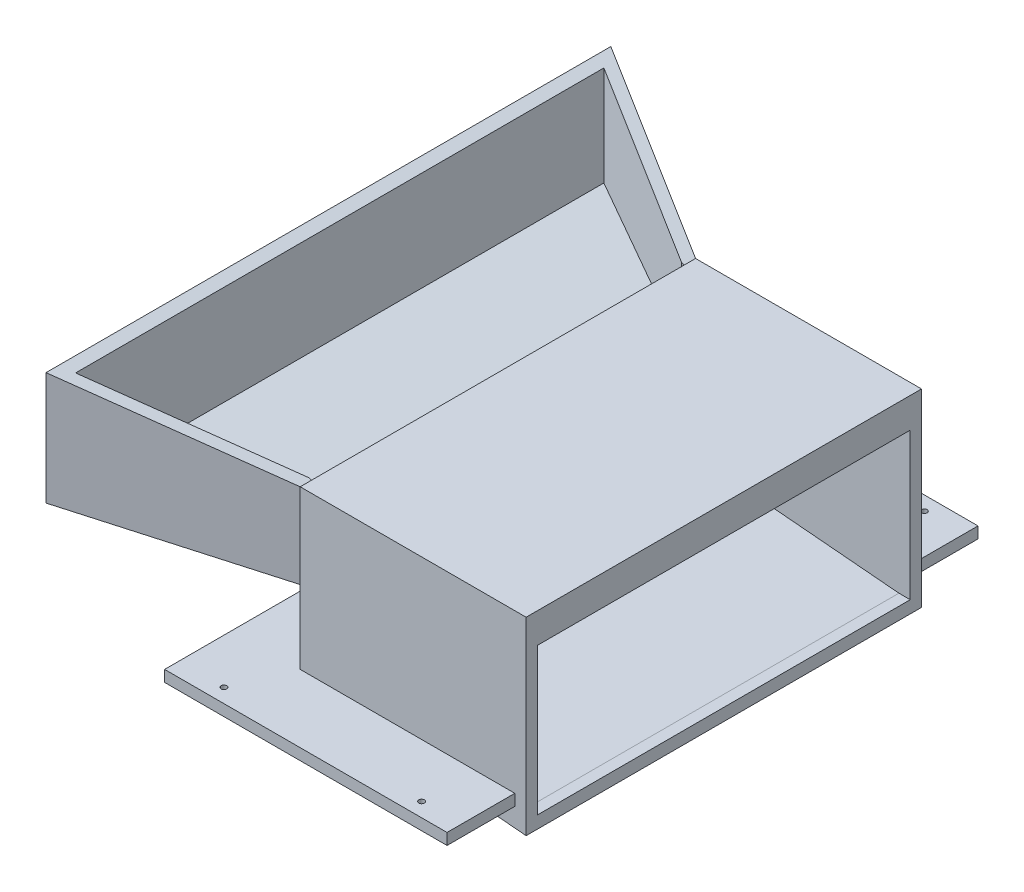
ISO-10303-21;
HEADER;
FILE_DESCRIPTION(('STEP AP214'),'2;1');
FILE_NAME('part.step','',(''),(''),'','','');
FILE_SCHEMA(('AUTOMOTIVE_DESIGN { 1 0 10303 214 1 1 1 1 }'));
ENDSEC;
DATA;
#1=APPLICATION_CONTEXT('core data for automotive mechanical design processes');
#2=APPLICATION_PROTOCOL_DEFINITION('international standard','automotive_design',2000,#1);
#3=PRODUCT_CONTEXT('',#1,'mechanical');
#4=PRODUCT('Part','Part','',(#3));
#5=PRODUCT_RELATED_PRODUCT_CATEGORY('part','',(#4));
#6=PRODUCT_DEFINITION_FORMATION('','',#4);
#7=PRODUCT_DEFINITION_CONTEXT('part definition',#1,'design');
#8=PRODUCT_DEFINITION('design','',#6,#7);
#9=PRODUCT_DEFINITION_SHAPE('','',#8);
#10=(LENGTH_UNIT() NAMED_UNIT(*) SI_UNIT(.MILLI.,.METRE.));
#11=(NAMED_UNIT(*) PLANE_ANGLE_UNIT() SI_UNIT($,.RADIAN.));
#12=(NAMED_UNIT(*) SI_UNIT($,.STERADIAN.) SOLID_ANGLE_UNIT());
#13=UNCERTAINTY_MEASURE_WITH_UNIT(LENGTH_MEASURE(1.E-05),#10,'distance_accuracy_value','');
#14=(GEOMETRIC_REPRESENTATION_CONTEXT(3) GLOBAL_UNCERTAINTY_ASSIGNED_CONTEXT((#13)) GLOBAL_UNIT_ASSIGNED_CONTEXT((#10,
#11,#12)) REPRESENTATION_CONTEXT('',''));
#15=CARTESIAN_POINT('',(0.,0.,0.));
#16=DIRECTION('',(0.,0.,1.));
#17=DIRECTION('',(1.,0.,0.));
#18=AXIS2_PLACEMENT_3D('',#15,#16,#17);
#19=CARTESIAN_POINT('',(90.,200.,-175.));
#20=DIRECTION('',(-1.,0.,0.));
#21=DIRECTION('',(0.,0.,1.));
#22=AXIS2_PLACEMENT_3D('',#19,#20,#21);
#23=PLANE('',#22);
#24=DIRECTION('',(0.,-1.,0.));
#25=VECTOR('',#24,1.);
#26=CARTESIAN_POINT('',(90.,200.,-165.));
#27=LINE('',#26,#25);
#28=CARTESIAN_POINT('',(90.,340.,-165.));
#29=VERTEX_POINT('',#28);
#30=CARTESIAN_POINT('',(90.,323.415352305509,-165.));
#31=VERTEX_POINT('',#30);
#32=EDGE_CURVE('E327',#29,#31,#27,.T.);
#33=ORIENTED_EDGE('',*,*,#32,.T.);
#34=DIRECTION('',(0.,0.,1.));
#35=VECTOR('',#34,1.);
#36=CARTESIAN_POINT('',(90.,323.415352305509,-165.));
#37=LINE('',#36,#35);
#38=CARTESIAN_POINT('',(90.0000000000001,323.415352305508,165.));
#39=VERTEX_POINT('',#38);
#40=EDGE_CURVE('E320',#31,#39,#37,.T.);
#41=ORIENTED_EDGE('',*,*,#40,.T.);
#42=DIRECTION('',(0.,-1.,0.));
#43=VECTOR('',#42,1.);
#44=CARTESIAN_POINT('',(90.0000000000001,200.,165.));
#45=LINE('',#44,#43);
#46=CARTESIAN_POINT('',(90.0000000000001,340.,165.));
#47=VERTEX_POINT('',#46);
#48=EDGE_CURVE('E359',#47,#39,#45,.T.);
#49=ORIENTED_EDGE('',*,*,#48,.F.);
#50=DIRECTION('',(0.,0.,-1.));
#51=VECTOR('',#50,1.);
#52=CARTESIAN_POINT('',(90.,340.,-175.));
#53=LINE('',#52,#51);
#54=EDGE_CURVE('E617',#47,#29,#53,.T.);
#55=ORIENTED_EDGE('',*,*,#54,.T.);
#56=EDGE_LOOP('',(#33,#41,#49,#55));
#57=FACE_BOUND('',#56,.T.);
#58=ADVANCED_FACE('F55',(#57),#23,.T.);
#59=CARTESIAN_POINT('',(95.0000000000002,285.,0.));
#60=DIRECTION('',(0.316227766016839,0.948683298050514,0.));
#61=DIRECTION('',(-0.948683298050514,0.316227766016839,0.));
#62=AXIS2_PLACEMENT_3D('',#59,#60,#61);
#63=PLANE('',#62);
#64=DIRECTION('',(0.,0.,1.));
#65=VECTOR('',#64,1.);
#66=CARTESIAN_POINT('',(-100.,350.,0.));
#67=LINE('',#66,#65);
#68=CARTESIAN_POINT('',(-100.,350.,165.));
#69=VERTEX_POINT('',#68);
#70=CARTESIAN_POINT('',(-100.,350.,175.));
#71=VERTEX_POINT('',#70);
#72=EDGE_CURVE('E377',#69,#71,#67,.T.);
#73=ORIENTED_EDGE('',*,*,#72,.F.);
#74=DIRECTION('',(-0.948683298050514,0.316227766016839,0.));
#75=VECTOR('',#74,1.);
#76=CARTESIAN_POINT('',(95.0000000000002,285.,165.));
#77=LINE('',#76,#75);
#78=CARTESIAN_POINT('',(-102.360679774998,350.786893258333,165.));
#79=VERTEX_POINT('',#78);
#80=EDGE_CURVE('E12',#69,#79,#77,.T.);
#81=ORIENTED_EDGE('',*,*,#80,.T.);
#82=DIRECTION('',(0.857142857142857,-0.285714285714286,-0.428571428571429));
#83=VECTOR('',#82,1.);
#84=CARTESIAN_POINT('',(119.36232412296,276.879225292347,54.1384980510211));
#85=LINE('',#84,#83);
#86=CARTESIAN_POINT('',(-240.,396.666666666667,233.819660112501));
#87=VERTEX_POINT('',#86);
#88=EDGE_CURVE('E569',#87,#79,#85,.T.);
#89=ORIENTED_EDGE('',*,*,#88,.F.);
#90=DIRECTION('',(0.,0.,-1.));
#91=VECTOR('',#90,1.);
#92=CARTESIAN_POINT('',(-240.,396.666666666667,0.));
#93=LINE('',#92,#91);
#94=CARTESIAN_POINT('',(-240.,396.666666666667,-233.819660112501));
#95=VERTEX_POINT('',#94);
#96=EDGE_CURVE('E579',#87,#95,#93,.T.);
#97=ORIENTED_EDGE('',*,*,#96,.T.);
#98=DIRECTION('',(0.857142857142857,-0.285714285714286,0.428571428571429));
#99=VECTOR('',#98,1.);
#100=CARTESIAN_POINT('',(119.36232412296,276.879225292347,-54.1384980510211));
#101=LINE('',#100,#99);
#102=CARTESIAN_POINT('',(-102.360679774998,350.786893258333,-165.));
#103=VERTEX_POINT('',#102);
#104=EDGE_CURVE('E565',#95,#103,#101,.T.);
#105=ORIENTED_EDGE('',*,*,#104,.T.);
#106=DIRECTION('',(0.948683298050514,-0.316227766016839,0.));
#107=VECTOR('',#106,1.);
#108=CARTESIAN_POINT('',(95.0000000000002,285.,-165.));
#109=LINE('',#108,#107);
#110=CARTESIAN_POINT('',(-100.,350.,-165.));
#111=VERTEX_POINT('',#110);
#112=EDGE_CURVE('E501',#103,#111,#109,.T.);
#113=ORIENTED_EDGE('',*,*,#112,.T.);
#114=CARTESIAN_POINT('',(-100.,350.,-175.));
#115=VERTEX_POINT('',#114);
#116=EDGE_CURVE('E371',#115,#111,#67,.T.);
#117=ORIENTED_EDGE('',*,*,#116,.F.);
#118=DIRECTION('',(0.857142857142857,-0.285714285714286,0.428571428571429));
#119=VECTOR('',#118,1.);
#120=CARTESIAN_POINT('',(-250.,400.,-250.));
#121=LINE('',#120,#119);
#122=CARTESIAN_POINT('',(-250.,400.,-250.));
#123=VERTEX_POINT('',#122);
#124=EDGE_CURVE('E498',#123,#115,#121,.T.);
#125=ORIENTED_EDGE('',*,*,#124,.F.);
#126=DIRECTION('',(0.,0.,-1.));
#127=VECTOR('',#126,1.);
#128=CARTESIAN_POINT('',(-250.,400.,-250.));
#129=LINE('',#128,#127);
#130=CARTESIAN_POINT('',(-250.,400.,250.));
#131=VERTEX_POINT('',#130);
#132=EDGE_CURVE('E480',#131,#123,#129,.T.);
#133=ORIENTED_EDGE('',*,*,#132,.F.);
#134=DIRECTION('',(0.857142857142857,-0.285714285714286,-0.428571428571429));
#135=VECTOR('',#134,1.);
#136=CARTESIAN_POINT('',(-250.,400.,250.));
#137=LINE('',#136,#135);
#138=EDGE_CURVE('E386',#131,#71,#137,.T.);
#139=ORIENTED_EDGE('',*,*,#138,.T.);
#140=EDGE_LOOP('',(#73,#81,#89,#97,#105,#113,#117,#125,#133,#139));
#141=FACE_BOUND('',#140,.T.);
#142=ADVANCED_FACE('F504',(#141),#63,.T.);
#143=CARTESIAN_POINT('',(100.,200.,-175.));
#144=DIRECTION('',(-1.,0.,0.));
#145=DIRECTION('',(0.,0.,1.));
#146=AXIS2_PLACEMENT_3D('',#143,#144,#145);
#147=PLANE('',#146);
#148=DIRECTION('',(0.,-1.,0.));
#149=VECTOR('',#148,1.);
#150=CARTESIAN_POINT('',(100.,323.415352305508,165.));
#151=LINE('',#150,#149);
#152=CARTESIAN_POINT('',(100.,323.415352305508,165.));
#153=VERTEX_POINT('',#152);
#154=CARTESIAN_POINT('',(100.,193.415352305508,165.));
#155=VERTEX_POINT('',#154);
#156=EDGE_CURVE('E673',#153,#155,#151,.T.);
#157=ORIENTED_EDGE('',*,*,#156,.F.);
#158=DIRECTION('',(0.,0.,1.));
#159=VECTOR('',#158,1.);
#160=CARTESIAN_POINT('',(100.,323.415352305509,-165.));
#161=LINE('',#160,#159);
#162=CARTESIAN_POINT('',(100.,323.415352305509,-165.));
#163=VERTEX_POINT('',#162);
#164=EDGE_CURVE('E315',#163,#153,#161,.T.);
#165=ORIENTED_EDGE('',*,*,#164,.F.);
#166=DIRECTION('',(0.,1.,0.));
#167=VECTOR('',#166,1.);
#168=CARTESIAN_POINT('',(100.,193.415352305508,-165.));
#169=LINE('',#168,#167);
#170=CARTESIAN_POINT('',(100.,193.415352305508,-165.));
#171=VERTEX_POINT('',#170);
#172=EDGE_CURVE('E326',#171,#163,#169,.T.);
#173=ORIENTED_EDGE('',*,*,#172,.F.);
#174=DIRECTION('',(0.,0.,-1.));
#175=VECTOR('',#174,1.);
#176=CARTESIAN_POINT('',(100.,193.415352305508,165.));
#177=LINE('',#176,#175);
#178=EDGE_CURVE('E676',#155,#171,#177,.T.);
#179=ORIENTED_EDGE('',*,*,#178,.F.);
#180=EDGE_LOOP('',(#157,#165,#173,#179));
#181=FACE_BOUND('',#180,.T.);
#182=DIRECTION('',(0.,-1.,0.));
#183=VECTOR('',#182,1.);
#184=CARTESIAN_POINT('',(100.,200.,175.));
#185=LINE('',#184,#183);
#186=CARTESIAN_POINT('',(100.,350.,175.));
#187=VERTEX_POINT('',#186);
#188=CARTESIAN_POINT('',(100.,182.502267294816,175.));
#189=VERTEX_POINT('',#188);
#190=EDGE_CURVE('E403',#187,#189,#185,.T.);
#191=ORIENTED_EDGE('',*,*,#190,.T.);
#192=DIRECTION('',(0.,0.,1.));
#193=VECTOR('',#192,1.);
#194=CARTESIAN_POINT('',(100.,182.502267294816,-175.));
#195=LINE('',#194,#193);
#196=CARTESIAN_POINT('',(100.,182.502267294816,-175.));
#197=VERTEX_POINT('',#196);
#198=EDGE_CURVE('E65',#189,#197,#195,.F.);
#199=ORIENTED_EDGE('',*,*,#198,.T.);
#200=DIRECTION('',(0.,-1.,0.));
#201=VECTOR('',#200,1.);
#202=CARTESIAN_POINT('',(100.,200.,-175.));
#203=LINE('',#202,#201);
#204=CARTESIAN_POINT('',(100.,350.,-175.));
#205=VERTEX_POINT('',#204);
#206=EDGE_CURVE('E397',#205,#197,#203,.T.);
#207=ORIENTED_EDGE('',*,*,#206,.F.);
#208=DIRECTION('',(0.,0.,-1.));
#209=VECTOR('',#208,1.);
#210=CARTESIAN_POINT('',(100.,350.,175.));
#211=LINE('',#210,#209);
#212=EDGE_CURVE('E391',#187,#205,#211,.T.);
#213=ORIENTED_EDGE('',*,*,#212,.F.);
#214=EDGE_LOOP('',(#191,#199,#207,#213));
#215=FACE_BOUND('',#214,.T.);
#216=ADVANCED_FACE('F548',(#181,#215),#147,.F.);
#217=CARTESIAN_POINT('',(-100.,200.,-175.));
#218=DIRECTION('',(0.,0.,1.));
#219=DIRECTION('',(1.,0.,0.));
#220=AXIS2_PLACEMENT_3D('',#217,#218,#219);
#221=PLANE('',#220);
#222=DIRECTION('',(0.,-1.,0.));
#223=VECTOR('',#222,1.);
#224=CARTESIAN_POINT('',(90.,210.,-175.));
#225=LINE('',#224,#223);
#226=CARTESIAN_POINT('',(90.,210.,-175.));
#227=VERTEX_POINT('',#226);
#228=CARTESIAN_POINT('',(90.,200.,-175.));
#229=VERTEX_POINT('',#228);
#230=EDGE_CURVE('E74',#227,#229,#225,.T.);
#231=ORIENTED_EDGE('',*,*,#230,.F.);
#232=DIRECTION('',(1.,0.,0.));
#233=VECTOR('',#232,1.);
#234=CARTESIAN_POINT('',(-100.,210.,-175.));
#235=LINE('',#234,#233);
#236=CARTESIAN_POINT('',(-100.,210.,-175.));
#237=VERTEX_POINT('',#236);
#238=EDGE_CURVE('E242',#237,#227,#235,.T.);
#239=ORIENTED_EDGE('',*,*,#238,.F.);
#240=DIRECTION('',(0.,-1.,0.));
#241=VECTOR('',#240,1.);
#242=CARTESIAN_POINT('',(-100.,350.,-175.));
#243=LINE('',#242,#241);
#244=CARTESIAN_POINT('',(-100.,275.,-175.));
#245=VERTEX_POINT('',#244);
#246=EDGE_CURVE('E382',#245,#237,#243,.T.);
#247=ORIENTED_EDGE('',*,*,#246,.F.);
#248=DIRECTION('',(0.,1.,0.));
#249=VECTOR('',#248,1.);
#250=CARTESIAN_POINT('',(-100.,0.,-175.));
#251=LINE('',#250,#249);
#252=EDGE_CURVE('E378',#115,#245,#251,.F.);
#253=ORIENTED_EDGE('',*,*,#252,.F.);
#254=DIRECTION('',(-1.,0.,0.));
#255=VECTOR('',#254,1.);
#256=CARTESIAN_POINT('',(100.,350.,-175.));
#257=LINE('',#256,#255);
#258=EDGE_CURVE('E387',#205,#115,#257,.T.);
#259=ORIENTED_EDGE('',*,*,#258,.F.);
#260=ORIENTED_EDGE('',*,*,#206,.T.);
#261=DIRECTION('',(-0.996194698091746,0.0871557427476554,0.));
#262=VECTOR('',#261,1.);
#263=CARTESIAN_POINT('',(-100.,200.,-175.));
#264=LINE('',#263,#262);
#265=CARTESIAN_POINT('',(-100.,200.,-175.));
#266=VERTEX_POINT('',#265);
#267=EDGE_CURVE('E402',#266,#197,#264,.F.);
#268=ORIENTED_EDGE('',*,*,#267,.F.);
#269=DIRECTION('',(1.,0.,0.));
#270=VECTOR('',#269,1.);
#271=CARTESIAN_POINT('',(-100.,200.,-175.));
#272=LINE('',#271,#270);
#273=EDGE_CURVE('E79',#266,#229,#272,.T.);
#274=ORIENTED_EDGE('',*,*,#273,.T.);
#275=EDGE_LOOP('',(#231,#239,#247,#253,#259,#260,#268,#274));
#276=FACE_BOUND('',#275,.T.);
#277=ADVANCED_FACE('F715',(#276),#221,.F.);
#278=CARTESIAN_POINT('',(-100.,200.,-175.));
#279=DIRECTION('',(-0.0871557427476554,-0.996194698091746,0.));
#280=DIRECTION('',(0.996194698091746,-0.0871557427476554,0.));
#281=AXIS2_PLACEMENT_3D('',#278,#279,#280);
#282=PLANE('',#281);
#283=ORIENTED_EDGE('',*,*,#198,.F.);
#284=DIRECTION('',(-0.996194698091746,0.0871557427476554,0.));
#285=VECTOR('',#284,1.);
#286=CARTESIAN_POINT('',(-100.,200.,175.));
#287=LINE('',#286,#285);
#288=CARTESIAN_POINT('',(-100.,200.,175.));
#289=VERTEX_POINT('',#288);
#290=EDGE_CURVE('E398',#289,#189,#287,.F.);
#291=ORIENTED_EDGE('',*,*,#290,.F.);
#292=DIRECTION('',(0.,0.,1.));
#293=VECTOR('',#292,1.);
#294=CARTESIAN_POINT('',(-100.,200.,-175.));
#295=LINE('',#294,#293);
#296=EDGE_CURVE('E369',#266,#289,#295,.T.);
#297=ORIENTED_EDGE('',*,*,#296,.F.);
#298=ORIENTED_EDGE('',*,*,#267,.T.);
#299=EDGE_LOOP('',(#283,#291,#297,#298));
#300=FACE_BOUND('',#299,.T.);
#301=ADVANCED_FACE('F57',(#300),#282,.T.);
#302=CARTESIAN_POINT('',(-100.,200.,175.));
#303=DIRECTION('',(0.,0.,-1.));
#304=DIRECTION('',(-1.,0.,0.));
#305=AXIS2_PLACEMENT_3D('',#302,#303,#304);
#306=PLANE('',#305);
#307=DIRECTION('',(0.,-1.,0.));
#308=VECTOR('',#307,1.);
#309=CARTESIAN_POINT('',(-100.,350.,175.));
#310=LINE('',#309,#308);
#311=CARTESIAN_POINT('',(-100.,275.,175.));
#312=VERTEX_POINT('',#311);
#313=CARTESIAN_POINT('',(-100.,210.,175.));
#314=VERTEX_POINT('',#313);
#315=EDGE_CURVE('E370',#312,#314,#310,.T.);
#316=ORIENTED_EDGE('',*,*,#315,.T.);
#317=DIRECTION('',(-1.,0.,0.));
#318=VECTOR('',#317,1.);
#319=CARTESIAN_POINT('',(-100.,210.,175.));
#320=LINE('',#319,#318);
#321=CARTESIAN_POINT('',(90.,210.,175.));
#322=VERTEX_POINT('',#321);
#323=EDGE_CURVE('E273',#322,#314,#320,.T.);
#324=ORIENTED_EDGE('',*,*,#323,.F.);
#325=DIRECTION('',(0.,-1.,0.));
#326=VECTOR('',#325,1.);
#327=CARTESIAN_POINT('',(90.,210.,175.));
#328=LINE('',#327,#326);
#329=CARTESIAN_POINT('',(90.,200.,175.));
#330=VERTEX_POINT('',#329);
#331=EDGE_CURVE('E277',#322,#330,#328,.T.);
#332=ORIENTED_EDGE('',*,*,#331,.T.);
#333=DIRECTION('',(-1.,0.,0.));
#334=VECTOR('',#333,1.);
#335=CARTESIAN_POINT('',(-100.,200.,175.));
#336=LINE('',#335,#334);
#337=EDGE_CURVE('E296',#330,#289,#336,.T.);
#338=ORIENTED_EDGE('',*,*,#337,.T.);
#339=ORIENTED_EDGE('',*,*,#290,.T.);
#340=ORIENTED_EDGE('',*,*,#190,.F.);
#341=DIRECTION('',(1.,0.,0.));
#342=VECTOR('',#341,1.);
#343=CARTESIAN_POINT('',(100.,350.,175.));
#344=LINE('',#343,#342);
#345=EDGE_CURVE('E375',#71,#187,#344,.T.);
#346=ORIENTED_EDGE('',*,*,#345,.F.);
#347=DIRECTION('',(0.,1.,0.));
#348=VECTOR('',#347,1.);
#349=CARTESIAN_POINT('',(-100.,200.,175.));
#350=LINE('',#349,#348);
#351=EDGE_CURVE('E365',#71,#312,#350,.F.);
#352=ORIENTED_EDGE('',*,*,#351,.T.);
#353=EDGE_LOOP('',(#316,#324,#332,#338,#339,#340,#346,#352));
#354=FACE_BOUND('',#353,.T.);
#355=ADVANCED_FACE('F711',(#354),#306,.F.);
#356=CARTESIAN_POINT('',(-100.,350.,175.));
#357=DIRECTION('',(1.,0.,0.));
#358=DIRECTION('',(0.,0.,-1.));
#359=AXIS2_PLACEMENT_3D('',#356,#357,#358);
#360=PLANE('',#359);
#361=ORIENTED_EDGE('',*,*,#246,.T.);
#362=DIRECTION('',(0.,0.,-1.));
#363=VECTOR('',#362,1.);
#364=CARTESIAN_POINT('',(-100.,210.,-175.));
#365=LINE('',#364,#363);
#366=EDGE_CURVE('E300',#314,#237,#365,.T.);
#367=ORIENTED_EDGE('',*,*,#366,.F.);
#368=ORIENTED_EDGE('',*,*,#315,.F.);
#369=DIRECTION('',(0.,0.,1.));
#370=VECTOR('',#369,1.);
#371=CARTESIAN_POINT('',(-100.,275.,-175.));
#372=LINE('',#371,#370);
#373=EDGE_CURVE('E383',#245,#312,#372,.T.);
#374=ORIENTED_EDGE('',*,*,#373,.F.);
#375=EDGE_LOOP('',(#361,#367,#368,#374));
#376=FACE_BOUND('',#375,.T.);
#377=ADVANCED_FACE('F707',(#376),#360,.F.);
#378=CARTESIAN_POINT('',(0.,350.,0.));
#379=DIRECTION('',(0.,1.,0.));
#380=DIRECTION('',(0.,0.,1.));
#381=AXIS2_PLACEMENT_3D('',#378,#379,#380);
#382=PLANE('',#381);
#383=ORIENTED_EDGE('',*,*,#116,.T.);
#384=EDGE_CURVE('E376',#111,#69,#67,.T.);
#385=ORIENTED_EDGE('',*,*,#384,.T.);
#386=ORIENTED_EDGE('',*,*,#72,.T.);
#387=ORIENTED_EDGE('',*,*,#345,.T.);
#388=ORIENTED_EDGE('',*,*,#212,.T.);
#389=ORIENTED_EDGE('',*,*,#258,.T.);
#390=EDGE_LOOP('',(#383,#385,#386,#387,#388,#389));
#391=FACE_BOUND('',#390,.T.);
#392=ADVANCED_FACE('F442',(#391),#382,.T.);
#393=CARTESIAN_POINT('',(-250.,0.,0.));
#394=DIRECTION('',(-1.,0.,0.));
#395=DIRECTION('',(0.,0.,1.));
#396=AXIS2_PLACEMENT_3D('',#393,#394,#395);
#397=PLANE('',#396);
#398=DIRECTION('',(0.,-1.,0.));
#399=VECTOR('',#398,1.);
#400=CARTESIAN_POINT('',(-250.,400.,-250.));
#401=LINE('',#400,#399);
#402=CARTESIAN_POINT('',(-250.,300.,-250.));
#403=VERTEX_POINT('',#402);
#404=EDGE_CURVE('E475',#123,#403,#401,.T.);
#405=ORIENTED_EDGE('',*,*,#404,.T.);
#406=DIRECTION('',(0.,0.,1.));
#407=VECTOR('',#406,1.);
#408=CARTESIAN_POINT('',(-250.,300.,-250.));
#409=LINE('',#408,#407);
#410=CARTESIAN_POINT('',(-250.,300.,250.));
#411=VERTEX_POINT('',#410);
#412=EDGE_CURVE('E467',#403,#411,#409,.T.);
#413=ORIENTED_EDGE('',*,*,#412,.T.);
#414=DIRECTION('',(0.,1.,0.));
#415=VECTOR('',#414,1.);
#416=CARTESIAN_POINT('',(-250.,400.,250.));
#417=LINE('',#416,#415);
#418=EDGE_CURVE('E474',#411,#131,#417,.T.);
#419=ORIENTED_EDGE('',*,*,#418,.T.);
#420=ORIENTED_EDGE('',*,*,#132,.T.);
#421=EDGE_LOOP('',(#405,#413,#419,#420));
#422=FACE_BOUND('',#421,.T.);
#423=ADVANCED_FACE('F431',(#422),#397,.T.);
#424=CARTESIAN_POINT('',(41.8918918918919,251.351351351351,0.));
#425=DIRECTION('',(-0.164398987305357,-0.986393923832144,0.));
#426=DIRECTION('',(0.986393923832144,-0.164398987305357,0.));
#427=AXIS2_PLACEMENT_3D('',#424,#425,#426);
#428=PLANE('',#427);
#429=DIRECTION('',(0.884651736929383,-0.147441956154897,0.442325868464692));
#430=VECTOR('',#429,1.);
#431=CARTESIAN_POINT('',(-250.,300.,-250.));
#432=LINE('',#431,#430);
#433=EDGE_CURVE('E492',#403,#245,#432,.T.);
#434=ORIENTED_EDGE('',*,*,#433,.T.);
#435=ORIENTED_EDGE('',*,*,#373,.T.);
#436=DIRECTION('',(0.884651736929383,-0.147441956154897,-0.442325868464692));
#437=VECTOR('',#436,1.);
#438=CARTESIAN_POINT('',(-250.,300.,250.));
#439=LINE('',#438,#437);
#440=EDGE_CURVE('E507',#411,#312,#439,.T.);
#441=ORIENTED_EDGE('',*,*,#440,.F.);
#442=ORIENTED_EDGE('',*,*,#412,.F.);
#443=EDGE_LOOP('',(#434,#435,#441,#442));
#444=FACE_BOUND('',#443,.T.);
#445=ADVANCED_FACE('F441',(#444),#428,.T.);
#446=CARTESIAN_POINT('',(50.,0.,99.9999999999999));
#447=DIRECTION('',(0.447213595499958,0.,0.894427190999916));
#448=DIRECTION('',(0.894427190999916,0.,-0.447213595499958));
#449=AXIS2_PLACEMENT_3D('',#446,#447,#448);
#450=PLANE('',#449);
#451=ORIENTED_EDGE('',*,*,#440,.T.);
#452=ORIENTED_EDGE('',*,*,#351,.F.);
#453=ORIENTED_EDGE('',*,*,#138,.F.);
#454=ORIENTED_EDGE('',*,*,#418,.F.);
#455=EDGE_LOOP('',(#451,#452,#453,#454));
#456=FACE_BOUND('',#455,.T.);
#457=ADVANCED_FACE('F525',(#456),#450,.T.);
#458=CARTESIAN_POINT('',(49.9999999999999,0.,-99.9999999999998));
#459=DIRECTION('',(0.447213595499958,0.,-0.894427190999916));
#460=DIRECTION('',(-0.894427190999916,0.,-0.447213595499958));
#461=AXIS2_PLACEMENT_3D('',#458,#459,#460);
#462=PLANE('',#461);
#463=ORIENTED_EDGE('',*,*,#124,.T.);
#464=ORIENTED_EDGE('',*,*,#252,.T.);
#465=ORIENTED_EDGE('',*,*,#433,.F.);
#466=ORIENTED_EDGE('',*,*,#404,.F.);
#467=EDGE_LOOP('',(#463,#464,#465,#466));
#468=FACE_BOUND('',#467,.T.);
#469=ADVANCED_FACE('F497',(#468),#462,.T.);
#470=CARTESIAN_POINT('',(95.0000000000002,285.,0.));
#471=DIRECTION('',(0.316227766016839,0.948683298050514,0.));
#472=DIRECTION('',(-0.948683298050514,0.316227766016839,0.));
#473=AXIS2_PLACEMENT_3D('',#470,#471,#472);
#474=PLANE('',#473);
#475=CARTESIAN_POINT('',(-69.9999999999998,340.,-165.));
#476=VERTEX_POINT('',#475);
#477=EDGE_CURVE('E560',#111,#476,#109,.T.);
#478=ORIENTED_EDGE('',*,*,#477,.T.);
#479=DIRECTION('',(0.,0.,1.));
#480=VECTOR('',#479,1.);
#481=CARTESIAN_POINT('',(-69.9999999999998,340.,0.));
#482=LINE('',#481,#480);
#483=CARTESIAN_POINT('',(-69.9999999999998,340.,165.));
#484=VERTEX_POINT('',#483);
#485=EDGE_CURVE('E571',#476,#484,#482,.T.);
#486=ORIENTED_EDGE('',*,*,#485,.T.);
#487=EDGE_CURVE('E67',#484,#69,#77,.T.);
#488=ORIENTED_EDGE('',*,*,#487,.T.);
#489=ORIENTED_EDGE('',*,*,#384,.F.);
#490=EDGE_LOOP('',(#478,#486,#488,#489));
#491=FACE_BOUND('',#490,.T.);
#492=ADVANCED_FACE('F537',(#491),#474,.F.);
#493=CARTESIAN_POINT('',(-100.,200.,-165.));
#494=DIRECTION('',(0.,0.,1.));
#495=DIRECTION('',(1.,0.,0.));
#496=AXIS2_PLACEMENT_3D('',#493,#494,#495);
#497=PLANE('',#496);
#498=ORIENTED_EDGE('',*,*,#32,.F.);
#499=DIRECTION('',(-1.,0.,0.));
#500=VECTOR('',#499,1.);
#501=CARTESIAN_POINT('',(-100.,340.,-165.));
#502=LINE('',#501,#500);
#503=EDGE_CURVE('E625',#29,#476,#502,.T.);
#504=ORIENTED_EDGE('',*,*,#503,.T.);
#505=ORIENTED_EDGE('',*,*,#477,.F.);
#506=ORIENTED_EDGE('',*,*,#112,.F.);
#507=DIRECTION('',(0.,-1.,0.));
#508=VECTOR('',#507,1.);
#509=CARTESIAN_POINT('',(-102.360679774998,0.,-165.));
#510=LINE('',#509,#508);
#511=CARTESIAN_POINT('',(-102.360679774998,285.531384179663,-165.));
#512=VERTEX_POINT('',#511);
#513=EDGE_CURVE('E610',#103,#512,#510,.T.);
#514=ORIENTED_EDGE('',*,*,#513,.T.);
#515=DIRECTION('',(0.986393923832144,-0.164398987305357,0.));
#516=VECTOR('',#515,1.);
#517=CARTESIAN_POINT('',(-86.1938479647843,282.836912211294,-165.));
#518=LINE('',#517,#516);
#519=CARTESIAN_POINT('',(-90.,283.47127088383,-165.));
#520=VERTEX_POINT('',#519);
#521=EDGE_CURVE('E588',#512,#520,#518,.T.);
#522=ORIENTED_EDGE('',*,*,#521,.T.);
#523=DIRECTION('',(0.,-1.,0.));
#524=VECTOR('',#523,1.);
#525=CARTESIAN_POINT('',(-90.,350.,-165.));
#526=LINE('',#525,#524);
#527=CARTESIAN_POINT('',(-90.,209.163311740174,-165.));
#528=VERTEX_POINT('',#527);
#529=EDGE_CURVE('E629',#520,#528,#526,.T.);
#530=ORIENTED_EDGE('',*,*,#529,.T.);
#531=DIRECTION('',(-0.996194698091746,0.0871557427476554,0.));
#532=VECTOR('',#531,1.);
#533=CARTESIAN_POINT('',(-99.1284425725235,209.961946980917,-165.));
#534=LINE('',#533,#532);
#535=CARTESIAN_POINT('',(90.,193.415352305508,-165.));
#536=VERTEX_POINT('',#535);
#537=EDGE_CURVE('E624',#528,#536,#534,.F.);
#538=ORIENTED_EDGE('',*,*,#537,.T.);
#539=DIRECTION('',(1.,0.,0.));
#540=VECTOR('',#539,1.);
#541=CARTESIAN_POINT('',(90.,193.415352305508,-165.));
#542=LINE('',#541,#540);
#543=EDGE_CURVE('E338',#536,#171,#542,.T.);
#544=ORIENTED_EDGE('',*,*,#543,.T.);
#545=ORIENTED_EDGE('',*,*,#172,.T.);
#546=DIRECTION('',(1.,0.,0.));
#547=VECTOR('',#546,1.);
#548=CARTESIAN_POINT('',(90.,323.415352305509,-165.));
#549=LINE('',#548,#547);
#550=EDGE_CURVE('E335',#31,#163,#549,.T.);
#551=ORIENTED_EDGE('',*,*,#550,.F.);
#552=EDGE_LOOP('',(#498,#504,#505,#506,#514,#522,#530,#538,#544,#545,#551));
#553=FACE_BOUND('',#552,.T.);
#554=ADVANCED_FACE('F649',(#553),#497,.T.);
#555=CARTESIAN_POINT('',(-99.1284425725235,209.961946980917,-175.));
#556=DIRECTION('',(-0.0871557427476554,-0.996194698091746,0.));
#557=DIRECTION('',(0.996194698091746,-0.0871557427476554,0.));
#558=AXIS2_PLACEMENT_3D('',#555,#556,#557);
#559=PLANE('',#558);
#560=DIRECTION('',(0.,0.,1.));
#561=VECTOR('',#560,1.);
#562=CARTESIAN_POINT('',(90.,193.415352305508,-175.));
#563=LINE('',#562,#561);
#564=CARTESIAN_POINT('',(90.,193.415352305508,165.));
#565=VERTEX_POINT('',#564);
#566=EDGE_CURVE('E358',#565,#536,#563,.F.);
#567=ORIENTED_EDGE('',*,*,#566,.T.);
#568=ORIENTED_EDGE('',*,*,#537,.F.);
#569=DIRECTION('',(0.,0.,-1.));
#570=VECTOR('',#569,1.);
#571=CARTESIAN_POINT('',(-90.,209.163311740174,175.));
#572=LINE('',#571,#570);
#573=CARTESIAN_POINT('',(-90.,209.163311740174,165.));
#574=VERTEX_POINT('',#573);
#575=EDGE_CURVE('E364',#528,#574,#572,.F.);
#576=ORIENTED_EDGE('',*,*,#575,.T.);
#577=DIRECTION('',(-0.996194698091746,0.0871557427476554,0.));
#578=VECTOR('',#577,1.);
#579=CARTESIAN_POINT('',(-99.1284425725234,209.961946980917,165.));
#580=LINE('',#579,#578);
#581=EDGE_CURVE('E363',#574,#565,#580,.F.);
#582=ORIENTED_EDGE('',*,*,#581,.T.);
#583=EDGE_LOOP('',(#567,#568,#576,#582));
#584=FACE_BOUND('',#583,.T.);
#585=ADVANCED_FACE('F656',(#584),#559,.F.);
#586=CARTESIAN_POINT('',(-100.,200.,165.));
#587=DIRECTION('',(0.,0.,-1.));
#588=DIRECTION('',(-1.,0.,0.));
#589=AXIS2_PLACEMENT_3D('',#586,#587,#588);
#590=PLANE('',#589);
#591=ORIENTED_EDGE('',*,*,#581,.F.);
#592=DIRECTION('',(0.,-1.,0.));
#593=VECTOR('',#592,1.);
#594=CARTESIAN_POINT('',(-90.,200.,165.));
#595=LINE('',#594,#593);
#596=CARTESIAN_POINT('',(-90.,283.47127088383,165.));
#597=VERTEX_POINT('',#596);
#598=EDGE_CURVE('E606',#597,#574,#595,.T.);
#599=ORIENTED_EDGE('',*,*,#598,.F.);
#600=DIRECTION('',(0.986393923832144,-0.164398987305357,0.));
#601=VECTOR('',#600,1.);
#602=CARTESIAN_POINT('',(43.5358817649455,261.215290589673,165.));
#603=LINE('',#602,#601);
#604=CARTESIAN_POINT('',(-102.360679774998,285.531384179663,165.));
#605=VERTEX_POINT('',#604);
#606=EDGE_CURVE('E564',#605,#597,#603,.T.);
#607=ORIENTED_EDGE('',*,*,#606,.F.);
#608=DIRECTION('',(0.,-1.,0.));
#609=VECTOR('',#608,1.);
#610=CARTESIAN_POINT('',(-102.360679774998,200.,165.));
#611=LINE('',#610,#609);
#612=EDGE_CURVE('E609',#79,#605,#611,.T.);
#613=ORIENTED_EDGE('',*,*,#612,.F.);
#614=ORIENTED_EDGE('',*,*,#80,.F.);
#615=ORIENTED_EDGE('',*,*,#487,.F.);
#616=DIRECTION('',(1.,0.,0.));
#617=VECTOR('',#616,1.);
#618=CARTESIAN_POINT('',(-100.,340.,165.));
#619=LINE('',#618,#617);
#620=EDGE_CURVE('E575',#484,#47,#619,.T.);
#621=ORIENTED_EDGE('',*,*,#620,.T.);
#622=ORIENTED_EDGE('',*,*,#48,.T.);
#623=DIRECTION('',(1.,0.,0.));
#624=VECTOR('',#623,1.);
#625=CARTESIAN_POINT('',(90.,323.415352305508,165.));
#626=LINE('',#625,#624);
#627=EDGE_CURVE('E325',#39,#153,#626,.T.);
#628=ORIENTED_EDGE('',*,*,#627,.T.);
#629=ORIENTED_EDGE('',*,*,#156,.T.);
#630=DIRECTION('',(1.,0.,0.));
#631=VECTOR('',#630,1.);
#632=CARTESIAN_POINT('',(90.,193.415352305508,165.));
#633=LINE('',#632,#631);
#634=EDGE_CURVE('E333',#565,#155,#633,.T.);
#635=ORIENTED_EDGE('',*,*,#634,.F.);
#636=EDGE_LOOP('',(#591,#599,#607,#613,#614,#615,#621,#622,#628,#629,#635));
#637=FACE_BOUND('',#636,.T.);
#638=ADVANCED_FACE('F670',(#637),#590,.T.);
#639=CARTESIAN_POINT('',(-90.,350.,175.));
#640=DIRECTION('',(1.,0.,0.));
#641=DIRECTION('',(0.,0.,-1.));
#642=AXIS2_PLACEMENT_3D('',#639,#640,#641);
#643=PLANE('',#642);
#644=ORIENTED_EDGE('',*,*,#598,.T.);
#645=ORIENTED_EDGE('',*,*,#575,.F.);
#646=ORIENTED_EDGE('',*,*,#529,.F.);
#647=DIRECTION('',(0.,0.,1.));
#648=VECTOR('',#647,1.);
#649=CARTESIAN_POINT('',(-90.,283.47127088383,0.));
#650=LINE('',#649,#648);
#651=EDGE_CURVE('E576',#520,#597,#650,.T.);
#652=ORIENTED_EDGE('',*,*,#651,.T.);
#653=EDGE_LOOP('',(#644,#645,#646,#652));
#654=FACE_BOUND('',#653,.T.);
#655=ADVANCED_FACE('F662',(#654),#643,.T.);
#656=CARTESIAN_POINT('',(0.,340.,0.));
#657=DIRECTION('',(0.,1.,0.));
#658=DIRECTION('',(0.,0.,1.));
#659=AXIS2_PLACEMENT_3D('',#656,#657,#658);
#660=PLANE('',#659);
#661=ORIENTED_EDGE('',*,*,#485,.F.);
#662=ORIENTED_EDGE('',*,*,#503,.F.);
#663=ORIENTED_EDGE('',*,*,#54,.F.);
#664=ORIENTED_EDGE('',*,*,#620,.F.);
#665=EDGE_LOOP('',(#661,#662,#663,#664));
#666=FACE_BOUND('',#665,.T.);
#667=ADVANCED_FACE('F647',(#666),#660,.F.);
#668=CARTESIAN_POINT('',(-240.,0.,0.));
#669=DIRECTION('',(-1.,0.,0.));
#670=DIRECTION('',(0.,0.,1.));
#671=AXIS2_PLACEMENT_3D('',#668,#669,#670);
#672=PLANE('',#671);
#673=DIRECTION('',(0.,-1.,0.));
#674=VECTOR('',#673,1.);
#675=CARTESIAN_POINT('',(-240.,0.,-233.819660112501));
#676=LINE('',#675,#674);
#677=CARTESIAN_POINT('',(-240.,308.47127088383,-233.819660112501));
#678=VERTEX_POINT('',#677);
#679=EDGE_CURVE('E337',#95,#678,#676,.T.);
#680=ORIENTED_EDGE('',*,*,#679,.F.);
#681=ORIENTED_EDGE('',*,*,#96,.F.);
#682=DIRECTION('',(0.,1.,0.));
#683=VECTOR('',#682,1.);
#684=CARTESIAN_POINT('',(-240.,0.,233.819660112501));
#685=LINE('',#684,#683);
#686=CARTESIAN_POINT('',(-240.,308.47127088383,233.819660112501));
#687=VERTEX_POINT('',#686);
#688=EDGE_CURVE('E584',#687,#87,#685,.T.);
#689=ORIENTED_EDGE('',*,*,#688,.F.);
#690=DIRECTION('',(0.,0.,1.));
#691=VECTOR('',#690,1.);
#692=CARTESIAN_POINT('',(-240.,308.47127088383,0.));
#693=LINE('',#692,#691);
#694=EDGE_CURVE('E345',#678,#687,#693,.T.);
#695=ORIENTED_EDGE('',*,*,#694,.F.);
#696=EDGE_LOOP('',(#680,#681,#689,#695));
#697=FACE_BOUND('',#696,.T.);
#698=ADVANCED_FACE('F800',(#697),#672,.F.);
#699=CARTESIAN_POINT('',(43.5358817649455,261.215290589673,0.));
#700=DIRECTION('',(-0.164398987305357,-0.986393923832144,0.));
#701=DIRECTION('',(0.986393923832144,-0.164398987305357,0.));
#702=AXIS2_PLACEMENT_3D('',#699,#700,#701);
#703=PLANE('',#702);
#704=DIRECTION('',(0.884651736929383,-0.147441956154897,0.442325868464692));
#705=VECTOR('',#704,1.);
#706=CARTESIAN_POINT('',(79.5561197245217,255.21191759641,-74.0416002502401));
#707=LINE('',#706,#705);
#708=EDGE_CURVE('E583',#678,#512,#707,.T.);
#709=ORIENTED_EDGE('',*,*,#708,.F.);
#710=ORIENTED_EDGE('',*,*,#694,.T.);
#711=DIRECTION('',(0.884651736929383,-0.147441956154897,-0.442325868464692));
#712=VECTOR('',#711,1.);
#713=CARTESIAN_POINT('',(79.5561197245218,255.21191759641,74.0416002502401));
#714=LINE('',#713,#712);
#715=EDGE_CURVE('E570',#687,#605,#714,.T.);
#716=ORIENTED_EDGE('',*,*,#715,.T.);
#717=ORIENTED_EDGE('',*,*,#606,.T.);
#718=ORIENTED_EDGE('',*,*,#651,.F.);
#719=ORIENTED_EDGE('',*,*,#521,.F.);
#720=EDGE_LOOP('',(#709,#710,#716,#717,#718,#719));
#721=FACE_BOUND('',#720,.T.);
#722=ADVANCED_FACE('F666',(#721),#703,.F.);
#723=CARTESIAN_POINT('',(45.5278640450004,0.,91.0557280900008));
#724=DIRECTION('',(0.447213595499958,0.,0.894427190999916));
#725=DIRECTION('',(0.894427190999916,0.,-0.447213595499958));
#726=AXIS2_PLACEMENT_3D('',#723,#724,#725);
#727=PLANE('',#726);
#728=ORIENTED_EDGE('',*,*,#715,.F.);
#729=ORIENTED_EDGE('',*,*,#688,.T.);
#730=ORIENTED_EDGE('',*,*,#88,.T.);
#731=ORIENTED_EDGE('',*,*,#612,.T.);
#732=EDGE_LOOP('',(#728,#729,#730,#731));
#733=FACE_BOUND('',#732,.T.);
#734=ADVANCED_FACE('F805',(#733),#727,.F.);
#735=CARTESIAN_POINT('',(45.5278640450003,0.,-91.0557280900007));
#736=DIRECTION('',(0.447213595499958,0.,-0.894427190999916));
#737=DIRECTION('',(-0.894427190999916,0.,-0.447213595499958));
#738=AXIS2_PLACEMENT_3D('',#735,#736,#737);
#739=PLANE('',#738);
#740=ORIENTED_EDGE('',*,*,#104,.F.);
#741=ORIENTED_EDGE('',*,*,#679,.T.);
#742=ORIENTED_EDGE('',*,*,#708,.T.);
#743=ORIENTED_EDGE('',*,*,#513,.F.);
#744=EDGE_LOOP('',(#740,#741,#742,#743));
#745=FACE_BOUND('',#744,.T.);
#746=ADVANCED_FACE('F444',(#745),#739,.F.);
#747=CARTESIAN_POINT('',(90.,323.415352305509,-165.));
#748=DIRECTION('',(0.,1.,0.));
#749=DIRECTION('',(0.,0.,1.));
#750=AXIS2_PLACEMENT_3D('',#747,#748,#749);
#751=PLANE('',#750);
#752=ORIENTED_EDGE('',*,*,#164,.T.);
#753=ORIENTED_EDGE('',*,*,#627,.F.);
#754=ORIENTED_EDGE('',*,*,#40,.F.);
#755=ORIENTED_EDGE('',*,*,#550,.T.);
#756=EDGE_LOOP('',(#752,#753,#754,#755));
#757=FACE_BOUND('',#756,.T.);
#758=ADVANCED_FACE('F685',(#757),#751,.F.);
#759=CARTESIAN_POINT('',(90.,193.415352305508,165.));
#760=DIRECTION('',(0.,-1.,0.));
#761=DIRECTION('',(0.,0.,-1.));
#762=AXIS2_PLACEMENT_3D('',#759,#760,#761);
#763=PLANE('',#762);
#764=ORIENTED_EDGE('',*,*,#178,.T.);
#765=ORIENTED_EDGE('',*,*,#543,.F.);
#766=ORIENTED_EDGE('',*,*,#566,.F.);
#767=ORIENTED_EDGE('',*,*,#634,.T.);
#768=EDGE_LOOP('',(#764,#765,#766,#767));
#769=FACE_BOUND('',#768,.T.);
#770=ADVANCED_FACE('F675',(#769),#763,.F.);
#771=CARTESIAN_POINT('',(90.,210.,-175.));
#772=DIRECTION('',(-1.,0.,0.));
#773=DIRECTION('',(0.,0.,1.));
#774=AXIS2_PLACEMENT_3D('',#771,#772,#773);
#775=PLANE('',#774);
#776=DIRECTION('',(0.,0.,-1.));
#777=VECTOR('',#776,1.);
#778=CARTESIAN_POINT('',(90.,200.,-175.));
#779=LINE('',#778,#777);
#780=CARTESIAN_POINT('',(90.,200.,-235.));
#781=VERTEX_POINT('',#780);
#782=EDGE_CURVE('E250',#229,#781,#779,.T.);
#783=ORIENTED_EDGE('',*,*,#782,.T.);
#784=DIRECTION('',(0.,-1.,0.));
#785=VECTOR('',#784,1.);
#786=CARTESIAN_POINT('',(90.,210.,-235.));
#787=LINE('',#786,#785);
#788=CARTESIAN_POINT('',(90.,210.,-235.));
#789=VERTEX_POINT('',#788);
#790=EDGE_CURVE('E247',#789,#781,#787,.T.);
#791=ORIENTED_EDGE('',*,*,#790,.F.);
#792=DIRECTION('',(0.,0.,-1.));
#793=VECTOR('',#792,1.);
#794=CARTESIAN_POINT('',(90.,210.,-175.));
#795=LINE('',#794,#793);
#796=EDGE_CURVE('E235',#227,#789,#795,.T.);
#797=ORIENTED_EDGE('',*,*,#796,.F.);
#798=ORIENTED_EDGE('',*,*,#230,.T.);
#799=EDGE_LOOP('',(#783,#791,#797,#798));
#800=FACE_BOUND('',#799,.T.);
#801=ADVANCED_FACE('F248',(#800),#775,.F.);
#802=CARTESIAN_POINT('',(-160.,210.,-235.));
#803=DIRECTION('',(0.,0.,1.));
#804=DIRECTION('',(1.,0.,0.));
#805=AXIS2_PLACEMENT_3D('',#802,#803,#804);
#806=PLANE('',#805);
#807=DIRECTION('',(-1.,0.,0.));
#808=VECTOR('',#807,1.);
#809=CARTESIAN_POINT('',(-160.,200.,-235.));
#810=LINE('',#809,#808);
#811=CARTESIAN_POINT('',(-160.,200.,-235.));
#812=VERTEX_POINT('',#811);
#813=EDGE_CURVE('E283',#781,#812,#810,.T.);
#814=ORIENTED_EDGE('',*,*,#813,.T.);
#815=DIRECTION('',(0.,-1.,0.));
#816=VECTOR('',#815,1.);
#817=CARTESIAN_POINT('',(-160.,210.,-235.));
#818=LINE('',#817,#816);
#819=CARTESIAN_POINT('',(-160.,210.,-235.));
#820=VERTEX_POINT('',#819);
#821=EDGE_CURVE('E254',#820,#812,#818,.T.);
#822=ORIENTED_EDGE('',*,*,#821,.F.);
#823=DIRECTION('',(-1.,0.,0.));
#824=VECTOR('',#823,1.);
#825=CARTESIAN_POINT('',(-160.,210.,-235.));
#826=LINE('',#825,#824);
#827=EDGE_CURVE('E240',#789,#820,#826,.T.);
#828=ORIENTED_EDGE('',*,*,#827,.F.);
#829=ORIENTED_EDGE('',*,*,#790,.T.);
#830=EDGE_LOOP('',(#814,#822,#828,#829));
#831=FACE_BOUND('',#830,.T.);
#832=ADVANCED_FACE('F256',(#831),#806,.F.);
#833=CARTESIAN_POINT('',(-160.,210.,-235.));
#834=DIRECTION('',(1.,0.,0.));
#835=DIRECTION('',(0.,0.,-1.));
#836=AXIS2_PLACEMENT_3D('',#833,#834,#835);
#837=PLANE('',#836);
#838=DIRECTION('',(0.,0.,1.));
#839=VECTOR('',#838,1.);
#840=CARTESIAN_POINT('',(-160.,200.,-235.));
#841=LINE('',#840,#839);
#842=CARTESIAN_POINT('',(-160.,200.,235.));
#843=VERTEX_POINT('',#842);
#844=EDGE_CURVE('E286',#812,#843,#841,.T.);
#845=ORIENTED_EDGE('',*,*,#844,.T.);
#846=DIRECTION('',(0.,-1.,0.));
#847=VECTOR('',#846,1.);
#848=CARTESIAN_POINT('',(-160.,210.,235.));
#849=LINE('',#848,#847);
#850=CARTESIAN_POINT('',(-160.,210.,235.));
#851=VERTEX_POINT('',#850);
#852=EDGE_CURVE('E307',#851,#843,#849,.T.);
#853=ORIENTED_EDGE('',*,*,#852,.F.);
#854=DIRECTION('',(0.,0.,1.));
#855=VECTOR('',#854,1.);
#856=CARTESIAN_POINT('',(-160.,210.,-235.));
#857=LINE('',#856,#855);
#858=EDGE_CURVE('E260',#820,#851,#857,.T.);
#859=ORIENTED_EDGE('',*,*,#858,.F.);
#860=ORIENTED_EDGE('',*,*,#821,.T.);
#861=EDGE_LOOP('',(#845,#853,#859,#860));
#862=FACE_BOUND('',#861,.T.);
#863=ADVANCED_FACE('F826',(#862),#837,.F.);
#864=CARTESIAN_POINT('',(-160.,210.,235.));
#865=DIRECTION('',(0.,0.,-1.));
#866=DIRECTION('',(-1.,0.,0.));
#867=AXIS2_PLACEMENT_3D('',#864,#865,#866);
#868=PLANE('',#867);
#869=DIRECTION('',(1.,0.,0.));
#870=VECTOR('',#869,1.);
#871=CARTESIAN_POINT('',(-160.,200.,235.));
#872=LINE('',#871,#870);
#873=CARTESIAN_POINT('',(90.,200.,235.));
#874=VERTEX_POINT('',#873);
#875=EDGE_CURVE('E289',#843,#874,#872,.T.);
#876=ORIENTED_EDGE('',*,*,#875,.T.);
#877=DIRECTION('',(0.,-1.,0.));
#878=VECTOR('',#877,1.);
#879=CARTESIAN_POINT('',(90.,210.,235.));
#880=LINE('',#879,#878);
#881=CARTESIAN_POINT('',(90.,210.,235.));
#882=VERTEX_POINT('',#881);
#883=EDGE_CURVE('E303',#882,#874,#880,.T.);
#884=ORIENTED_EDGE('',*,*,#883,.F.);
#885=DIRECTION('',(1.,0.,0.));
#886=VECTOR('',#885,1.);
#887=CARTESIAN_POINT('',(-160.,210.,235.));
#888=LINE('',#887,#886);
#889=EDGE_CURVE('E263',#851,#882,#888,.T.);
#890=ORIENTED_EDGE('',*,*,#889,.F.);
#891=ORIENTED_EDGE('',*,*,#852,.T.);
#892=EDGE_LOOP('',(#876,#884,#890,#891));
#893=FACE_BOUND('',#892,.T.);
#894=ADVANCED_FACE('F829',(#893),#868,.F.);
#895=CARTESIAN_POINT('',(90.,210.,235.));
#896=DIRECTION('',(-1.,0.,0.));
#897=DIRECTION('',(0.,0.,1.));
#898=AXIS2_PLACEMENT_3D('',#895,#896,#897);
#899=PLANE('',#898);
#900=DIRECTION('',(0.,0.,-1.));
#901=VECTOR('',#900,1.);
#902=CARTESIAN_POINT('',(90.,200.,235.));
#903=LINE('',#902,#901);
#904=EDGE_CURVE('E292',#874,#330,#903,.T.);
#905=ORIENTED_EDGE('',*,*,#904,.T.);
#906=ORIENTED_EDGE('',*,*,#331,.F.);
#907=DIRECTION('',(0.,0.,-1.));
#908=VECTOR('',#907,1.);
#909=CARTESIAN_POINT('',(90.,210.,235.));
#910=LINE('',#909,#908);
#911=EDGE_CURVE('E269',#882,#322,#910,.T.);
#912=ORIENTED_EDGE('',*,*,#911,.F.);
#913=ORIENTED_EDGE('',*,*,#883,.T.);
#914=EDGE_LOOP('',(#905,#906,#912,#913));
#915=FACE_BOUND('',#914,.T.);
#916=ADVANCED_FACE('F761',(#915),#899,.F.);
#917=CARTESIAN_POINT('',(0.,210.,0.));
#918=DIRECTION('',(0.,1.,0.));
#919=DIRECTION('',(0.,0.,1.));
#920=AXIS2_PLACEMENT_3D('',#917,#918,#919);
#921=PLANE('',#920);
#922=CARTESIAN_POINT('',(55.,210.,-222.5));
#923=DIRECTION('',(0.,1.,0.));
#924=DIRECTION('',(0.,0.,1.));
#925=AXIS2_PLACEMENT_3D('',#922,#923,#924);
#926=CIRCLE('',#925,2.5);
#927=CARTESIAN_POINT('',(55.,210.,-220.));
#928=VERTEX_POINT('',#927);
#929=EDGE_CURVE('E736',#928,#928,#926,.T.);
#930=ORIENTED_EDGE('',*,*,#929,.F.);
#931=EDGE_LOOP('',(#930));
#932=FACE_BOUND('',#931,.T.);
#933=CARTESIAN_POINT('',(-120.,210.,-222.5));
#934=DIRECTION('',(0.,1.,0.));
#935=DIRECTION('',(0.,0.,1.));
#936=AXIS2_PLACEMENT_3D('',#933,#934,#935);
#937=CIRCLE('',#936,2.5);
#938=CARTESIAN_POINT('',(-120.,210.,-220.));
#939=VERTEX_POINT('',#938);
#940=EDGE_CURVE('E744',#939,#939,#937,.T.);
#941=ORIENTED_EDGE('',*,*,#940,.F.);
#942=EDGE_LOOP('',(#941));
#943=FACE_BOUND('',#942,.T.);
#944=CARTESIAN_POINT('',(-120.,210.,222.5));
#945=DIRECTION('',(0.,1.,0.));
#946=DIRECTION('',(0.,0.,1.));
#947=AXIS2_PLACEMENT_3D('',#944,#945,#946);
#948=CIRCLE('',#947,2.5);
#949=CARTESIAN_POINT('',(-120.,210.,225.));
#950=VERTEX_POINT('',#949);
#951=EDGE_CURVE('E728',#950,#950,#948,.T.);
#952=ORIENTED_EDGE('',*,*,#951,.F.);
#953=EDGE_LOOP('',(#952));
#954=FACE_BOUND('',#953,.T.);
#955=CARTESIAN_POINT('',(55.,210.,222.5));
#956=DIRECTION('',(0.,1.,0.));
#957=DIRECTION('',(0.,0.,1.));
#958=AXIS2_PLACEMENT_3D('',#955,#956,#957);
#959=CIRCLE('',#958,2.5);
#960=CARTESIAN_POINT('',(55.,210.,225.));
#961=VERTEX_POINT('',#960);
#962=EDGE_CURVE('E724',#961,#961,#959,.T.);
#963=ORIENTED_EDGE('',*,*,#962,.F.);
#964=EDGE_LOOP('',(#963));
#965=FACE_BOUND('',#964,.T.);
#966=ORIENTED_EDGE('',*,*,#366,.T.);
#967=ORIENTED_EDGE('',*,*,#238,.T.);
#968=ORIENTED_EDGE('',*,*,#796,.T.);
#969=ORIENTED_EDGE('',*,*,#827,.T.);
#970=ORIENTED_EDGE('',*,*,#858,.T.);
#971=ORIENTED_EDGE('',*,*,#889,.T.);
#972=ORIENTED_EDGE('',*,*,#911,.T.);
#973=ORIENTED_EDGE('',*,*,#323,.T.);
#974=EDGE_LOOP('',(#966,#967,#968,#969,#970,#971,#972,#973));
#975=FACE_BOUND('',#974,.T.);
#976=ADVANCED_FACE('F238',(#932,#943,#954,#965,#975),#921,.T.);
#977=CARTESIAN_POINT('',(0.,200.,0.));
#978=DIRECTION('',(0.,1.,0.));
#979=DIRECTION('',(0.,0.,1.));
#980=AXIS2_PLACEMENT_3D('',#977,#978,#979);
#981=PLANE('',#980);
#982=CARTESIAN_POINT('',(55.,200.,-222.5));
#983=DIRECTION('',(0.,1.,0.));
#984=DIRECTION('',(0.,0.,1.));
#985=AXIS2_PLACEMENT_3D('',#982,#983,#984);
#986=CIRCLE('',#985,2.5);
#987=CARTESIAN_POINT('',(55.,200.,-220.));
#988=VERTEX_POINT('',#987);
#989=EDGE_CURVE('E732',#988,#988,#986,.T.);
#990=ORIENTED_EDGE('',*,*,#989,.T.);
#991=EDGE_LOOP('',(#990));
#992=FACE_BOUND('',#991,.T.);
#993=CARTESIAN_POINT('',(-120.,200.,-222.5));
#994=DIRECTION('',(0.,1.,0.));
#995=DIRECTION('',(0.,0.,1.));
#996=AXIS2_PLACEMENT_3D('',#993,#994,#995);
#997=CIRCLE('',#996,2.5);
#998=CARTESIAN_POINT('',(-120.,200.,-220.));
#999=VERTEX_POINT('',#998);
#1000=EDGE_CURVE('E740',#999,#999,#997,.T.);
#1001=ORIENTED_EDGE('',*,*,#1000,.T.);
#1002=EDGE_LOOP('',(#1001));
#1003=FACE_BOUND('',#1002,.T.);
#1004=CARTESIAN_POINT('',(-120.,200.,222.5));
#1005=DIRECTION('',(0.,1.,0.));
#1006=DIRECTION('',(0.,0.,1.));
#1007=AXIS2_PLACEMENT_3D('',#1004,#1005,#1006);
#1008=CIRCLE('',#1007,2.5);
#1009=CARTESIAN_POINT('',(-120.,200.,225.));
#1010=VERTEX_POINT('',#1009);
#1011=EDGE_CURVE('E748',#1010,#1010,#1008,.T.);
#1012=ORIENTED_EDGE('',*,*,#1011,.T.);
#1013=EDGE_LOOP('',(#1012));
#1014=FACE_BOUND('',#1013,.T.);
#1015=CARTESIAN_POINT('',(55.,200.,222.5));
#1016=DIRECTION('',(0.,1.,0.));
#1017=DIRECTION('',(0.,0.,1.));
#1018=AXIS2_PLACEMENT_3D('',#1015,#1016,#1017);
#1019=CIRCLE('',#1018,2.5);
#1020=CARTESIAN_POINT('',(55.,200.,225.));
#1021=VERTEX_POINT('',#1020);
#1022=EDGE_CURVE('E280',#1021,#1021,#1019,.T.);
#1023=ORIENTED_EDGE('',*,*,#1022,.T.);
#1024=EDGE_LOOP('',(#1023));
#1025=FACE_BOUND('',#1024,.T.);
#1026=ORIENTED_EDGE('',*,*,#296,.T.);
#1027=ORIENTED_EDGE('',*,*,#337,.F.);
#1028=ORIENTED_EDGE('',*,*,#904,.F.);
#1029=ORIENTED_EDGE('',*,*,#875,.F.);
#1030=ORIENTED_EDGE('',*,*,#844,.F.);
#1031=ORIENTED_EDGE('',*,*,#813,.F.);
#1032=ORIENTED_EDGE('',*,*,#782,.F.);
#1033=ORIENTED_EDGE('',*,*,#273,.F.);
#1034=EDGE_LOOP('',(#1026,#1027,#1028,#1029,#1030,#1031,#1032,#1033));
#1035=FACE_BOUND('',#1034,.T.);
#1036=ADVANCED_FACE('F760',(#992,#1003,#1014,#1025,#1035),#981,.F.);
#1037=CARTESIAN_POINT('',(55.,200.,222.5));
#1038=DIRECTION('',(0.,1.,0.));
#1039=DIRECTION('',(0.,0.,1.));
#1040=AXIS2_PLACEMENT_3D('',#1037,#1038,#1039);
#1041=CYLINDRICAL_SURFACE('',#1040,2.5);
#1042=ORIENTED_EDGE('',*,*,#1022,.F.);
#1043=EDGE_LOOP('',(#1042));
#1044=FACE_BOUND('',#1043,.T.);
#1045=ORIENTED_EDGE('',*,*,#962,.T.);
#1046=EDGE_LOOP('',(#1045));
#1047=FACE_BOUND('',#1046,.T.);
#1048=ADVANCED_FACE('F766',(#1044,#1047),#1041,.F.);
#1049=CARTESIAN_POINT('',(-120.,200.,222.5));
#1050=DIRECTION('',(0.,1.,0.));
#1051=DIRECTION('',(0.,0.,1.));
#1052=AXIS2_PLACEMENT_3D('',#1049,#1050,#1051);
#1053=CYLINDRICAL_SURFACE('',#1052,2.5);
#1054=ORIENTED_EDGE('',*,*,#1011,.F.);
#1055=EDGE_LOOP('',(#1054));
#1056=FACE_BOUND('',#1055,.T.);
#1057=ORIENTED_EDGE('',*,*,#951,.T.);
#1058=EDGE_LOOP('',(#1057));
#1059=FACE_BOUND('',#1058,.T.);
#1060=ADVANCED_FACE('F756',(#1056,#1059),#1053,.F.);
#1061=CARTESIAN_POINT('',(-120.,200.,-222.5));
#1062=DIRECTION('',(0.,1.,0.));
#1063=DIRECTION('',(0.,0.,1.));
#1064=AXIS2_PLACEMENT_3D('',#1061,#1062,#1063);
#1065=CYLINDRICAL_SURFACE('',#1064,2.5);
#1066=ORIENTED_EDGE('',*,*,#1000,.F.);
#1067=EDGE_LOOP('',(#1066));
#1068=FACE_BOUND('',#1067,.T.);
#1069=ORIENTED_EDGE('',*,*,#940,.T.);
#1070=EDGE_LOOP('',(#1069));
#1071=FACE_BOUND('',#1070,.T.);
#1072=ADVANCED_FACE('F774',(#1068,#1071),#1065,.F.);
#1073=CARTESIAN_POINT('',(55.,200.,-222.5));
#1074=DIRECTION('',(0.,1.,0.));
#1075=DIRECTION('',(0.,0.,1.));
#1076=AXIS2_PLACEMENT_3D('',#1073,#1074,#1075);
#1077=CYLINDRICAL_SURFACE('',#1076,2.5);
#1078=ORIENTED_EDGE('',*,*,#989,.F.);
#1079=EDGE_LOOP('',(#1078));
#1080=FACE_BOUND('',#1079,.T.);
#1081=ORIENTED_EDGE('',*,*,#929,.T.);
#1082=EDGE_LOOP('',(#1081));
#1083=FACE_BOUND('',#1082,.T.);
#1084=ADVANCED_FACE('F996',(#1080,#1083),#1077,.F.);
#1085=CLOSED_SHELL('',(#58,#142,#216,#277,#301,#355,#377,#392,#423,#445,#457,#469,#492,#554,
#585,#638,#655,#667,#698,#722,#734,#746,#758,#770,#801,#832,#863,#894,#916,#976,#1036,#1048,
#1060,#1072,#1084));
#1086=MANIFOLD_SOLID_BREP('B2',#1085);
#1087=ADVANCED_BREP_SHAPE_REPRESENTATION('',(#18,#1086),#14);
#1088=SHAPE_DEFINITION_REPRESENTATION(#9,#1087);
ENDSEC;
END-ISO-10303-21;
